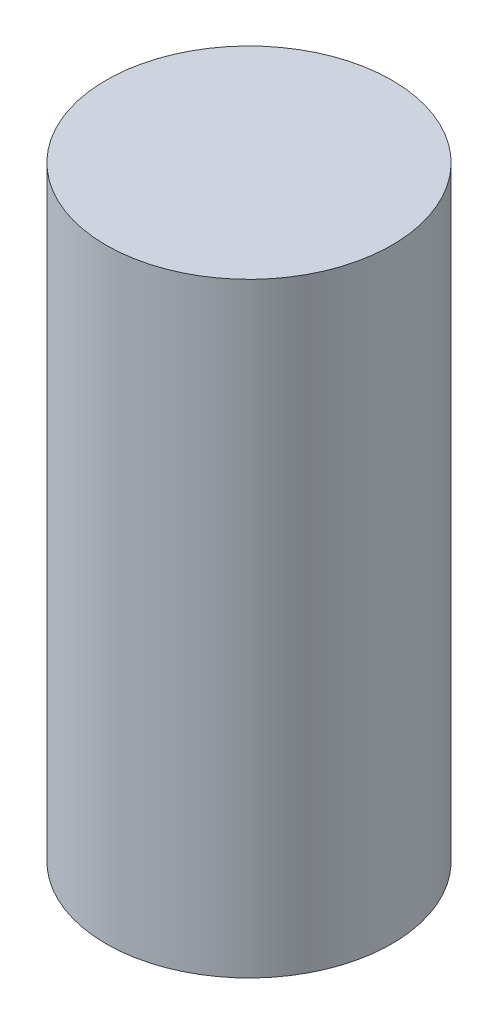
ISO-10303-21;
HEADER;
FILE_DESCRIPTION(('STEP AP214'),'2;1');
FILE_NAME('part.step','',(''),(''),'','','');
FILE_SCHEMA(('AUTOMOTIVE_DESIGN { 1 0 10303 214 1 1 1 1 }'));
ENDSEC;
DATA;
#1=APPLICATION_CONTEXT('core data for automotive mechanical design processes');
#2=APPLICATION_PROTOCOL_DEFINITION('international standard','automotive_design',2000,#1);
#3=PRODUCT_CONTEXT('',#1,'mechanical');
#4=PRODUCT('Part','Part','',(#3));
#5=PRODUCT_RELATED_PRODUCT_CATEGORY('part','',(#4));
#6=PRODUCT_DEFINITION_FORMATION('','',#4);
#7=PRODUCT_DEFINITION_CONTEXT('part definition',#1,'design');
#8=PRODUCT_DEFINITION('design','',#6,#7);
#9=PRODUCT_DEFINITION_SHAPE('','',#8);
#10=(LENGTH_UNIT() NAMED_UNIT(*) SI_UNIT(.MILLI.,.METRE.));
#11=(NAMED_UNIT(*) PLANE_ANGLE_UNIT() SI_UNIT($,.RADIAN.));
#12=(NAMED_UNIT(*) SI_UNIT($,.STERADIAN.) SOLID_ANGLE_UNIT());
#13=UNCERTAINTY_MEASURE_WITH_UNIT(LENGTH_MEASURE(1.E-05),#10,'distance_accuracy_value','');
#14=(GEOMETRIC_REPRESENTATION_CONTEXT(3) GLOBAL_UNCERTAINTY_ASSIGNED_CONTEXT((#13)) GLOBAL_UNIT_ASSIGNED_CONTEXT((#10,
#11,#12)) REPRESENTATION_CONTEXT('',''));
#15=CARTESIAN_POINT('',(0.,0.,0.));
#16=DIRECTION('',(0.,0.,1.));
#17=DIRECTION('',(1.,0.,0.));
#18=AXIS2_PLACEMENT_3D('',#15,#16,#17);
#19=CARTESIAN_POINT('',(0.,254.,0.));
#20=DIRECTION('',(0.,-1.,0.));
#21=DIRECTION('',(0.,0.,-1.));
#22=AXIS2_PLACEMENT_3D('',#19,#20,#21);
#23=CYLINDRICAL_SURFACE('',#22,60.);
#24=CARTESIAN_POINT('',(0.,254.,0.));
#25=DIRECTION('',(0.,1.,0.));
#26=DIRECTION('',(0.,0.,1.));
#27=AXIS2_PLACEMENT_3D('',#24,#25,#26);
#28=CIRCLE('',#27,60.);
#29=CARTESIAN_POINT('',(0.,254.,60.));
#30=VERTEX_POINT('',#29);
#31=EDGE_CURVE('E10',#30,#30,#28,.T.);
#32=ORIENTED_EDGE('',*,*,#31,.F.);
#33=EDGE_LOOP('',(#32));
#34=FACE_BOUND('',#33,.T.);
#35=CARTESIAN_POINT('',(0.,0.,0.));
#36=DIRECTION('',(0.,1.,0.));
#37=DIRECTION('',(0.,0.,1.));
#38=AXIS2_PLACEMENT_3D('',#35,#36,#37);
#39=CIRCLE('',#38,60.);
#40=CARTESIAN_POINT('',(0.,0.,60.));
#41=VERTEX_POINT('',#40);
#42=EDGE_CURVE('E40',#41,#41,#39,.T.);
#43=ORIENTED_EDGE('',*,*,#42,.T.);
#44=EDGE_LOOP('',(#43));
#45=FACE_BOUND('',#44,.T.);
#46=ADVANCED_FACE('F37',(#34,#45),#23,.T.);
#47=CARTESIAN_POINT('',(0.,254.,0.));
#48=DIRECTION('',(0.,1.,0.));
#49=DIRECTION('',(0.,0.,1.));
#50=AXIS2_PLACEMENT_3D('',#47,#48,#49);
#51=PLANE('',#50);
#52=ORIENTED_EDGE('',*,*,#31,.T.);
#53=EDGE_LOOP('',(#52));
#54=FACE_BOUND('',#53,.T.);
#55=ADVANCED_FACE('F54',(#54),#51,.T.);
#56=CARTESIAN_POINT('',(0.,0.,0.));
#57=DIRECTION('',(0.,1.,0.));
#58=DIRECTION('',(0.,0.,1.));
#59=AXIS2_PLACEMENT_3D('',#56,#57,#58);
#60=PLANE('',#59);
#61=ORIENTED_EDGE('',*,*,#42,.F.);
#62=EDGE_LOOP('',(#61));
#63=FACE_BOUND('',#62,.T.);
#64=ADVANCED_FACE('F52',(#63),#60,.F.);
#65=CLOSED_SHELL('',(#46,#55,#64));
#66=MANIFOLD_SOLID_BREP('B2',#65);
#67=ADVANCED_BREP_SHAPE_REPRESENTATION('',(#18,#66),#14);
#68=SHAPE_DEFINITION_REPRESENTATION(#9,#67);
ENDSEC;
END-ISO-10303-21;
